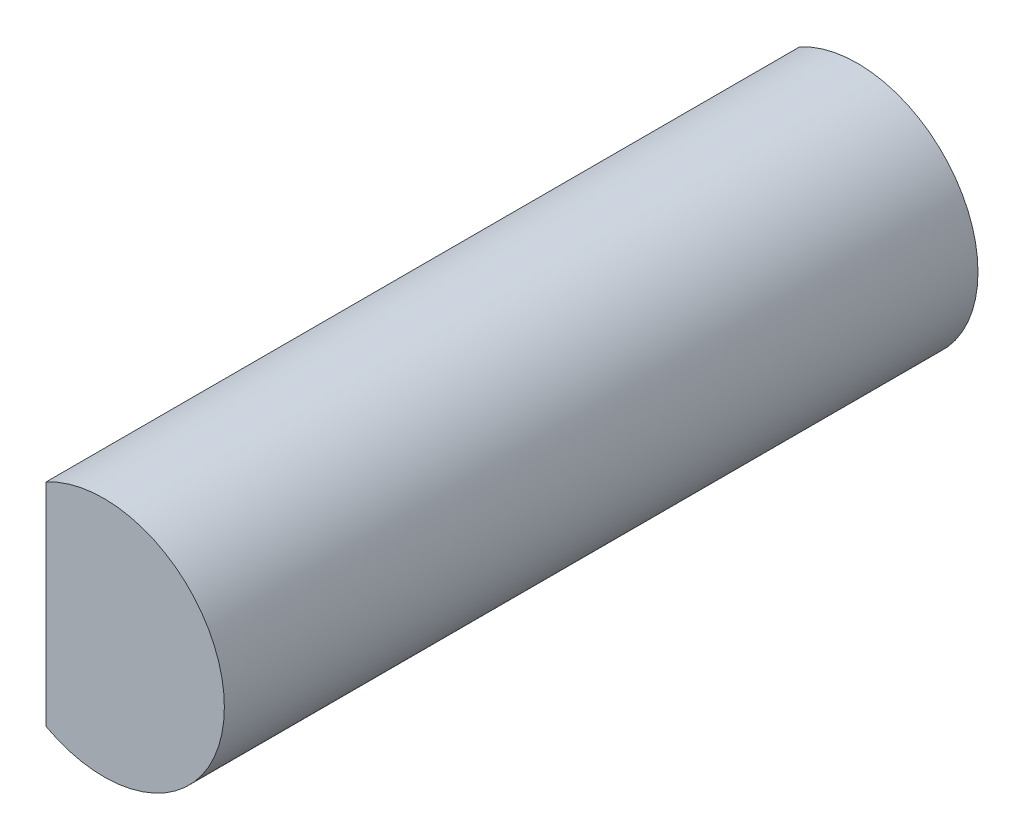
ISO-10303-21;
HEADER;
FILE_DESCRIPTION(('STEP AP214'),'2;1');
FILE_NAME('part.step','',(''),(''),'','','');
FILE_SCHEMA(('AUTOMOTIVE_DESIGN { 1 0 10303 214 1 1 1 1 }'));
ENDSEC;
DATA;
#1=APPLICATION_CONTEXT('core data for automotive mechanical design processes');
#2=APPLICATION_PROTOCOL_DEFINITION('international standard','automotive_design',2000,#1);
#3=PRODUCT_CONTEXT('',#1,'mechanical');
#4=PRODUCT('Part','Part','',(#3));
#5=PRODUCT_RELATED_PRODUCT_CATEGORY('part','',(#4));
#6=PRODUCT_DEFINITION_FORMATION('','',#4);
#7=PRODUCT_DEFINITION_CONTEXT('part definition',#1,'design');
#8=PRODUCT_DEFINITION('design','',#6,#7);
#9=PRODUCT_DEFINITION_SHAPE('','',#8);
#10=(LENGTH_UNIT() NAMED_UNIT(*) SI_UNIT(.MILLI.,.METRE.));
#11=(NAMED_UNIT(*) PLANE_ANGLE_UNIT() SI_UNIT($,.RADIAN.));
#12=(NAMED_UNIT(*) SI_UNIT($,.STERADIAN.) SOLID_ANGLE_UNIT());
#13=UNCERTAINTY_MEASURE_WITH_UNIT(LENGTH_MEASURE(1.E-05),#10,'distance_accuracy_value','');
#14=(GEOMETRIC_REPRESENTATION_CONTEXT(3) GLOBAL_UNCERTAINTY_ASSIGNED_CONTEXT((#13)) GLOBAL_UNIT_ASSIGNED_CONTEXT((#10,
#11,#12)) REPRESENTATION_CONTEXT('',''));
#15=CARTESIAN_POINT('',(0.,0.,0.));
#16=DIRECTION('',(0.,0.,1.));
#17=DIRECTION('',(1.,0.,0.));
#18=AXIS2_PLACEMENT_3D('',#15,#16,#17);
#19=CARTESIAN_POINT('',(0.,0.,30.));
#20=DIRECTION('',(0.,0.,-1.));
#21=DIRECTION('',(-1.,0.,0.));
#22=AXIS2_PLACEMENT_3D('',#19,#20,#21);
#23=CYLINDRICAL_SURFACE('',#22,4.8);
#24=CARTESIAN_POINT('',(0.,0.,0.));
#25=DIRECTION('',(0.,0.,1.));
#26=DIRECTION('',(1.,0.,0.));
#27=AXIS2_PLACEMENT_3D('',#24,#25,#26);
#28=CIRCLE('',#27,4.8);
#29=CARTESIAN_POINT('',(-2.30000000000001,-4.21307488658818,0.));
#30=VERTEX_POINT('',#29);
#31=CARTESIAN_POINT('',(-2.30000000000001,4.21307488658818,0.));
#32=VERTEX_POINT('',#31);
#33=EDGE_CURVE('E70',#30,#32,#28,.T.);
#34=ORIENTED_EDGE('',*,*,#33,.T.);
#35=DIRECTION('',(0.,0.,-1.));
#36=VECTOR('',#35,1.);
#37=CARTESIAN_POINT('',(-2.30000000000001,4.21307488658818,30.));
#38=LINE('',#37,#36);
#39=CARTESIAN_POINT('',(-2.30000000000001,4.21307488658818,30.));
#40=VERTEX_POINT('',#39);
#41=EDGE_CURVE('E11',#40,#32,#38,.T.);
#42=ORIENTED_EDGE('',*,*,#41,.F.);
#43=CARTESIAN_POINT('',(0.,0.,30.));
#44=DIRECTION('',(0.,0.,1.));
#45=DIRECTION('',(1.,0.,0.));
#46=AXIS2_PLACEMENT_3D('',#43,#44,#45);
#47=CIRCLE('',#46,4.8);
#48=CARTESIAN_POINT('',(-2.30000000000001,-4.21307488658818,30.));
#49=VERTEX_POINT('',#48);
#50=EDGE_CURVE('E69',#49,#40,#47,.T.);
#51=ORIENTED_EDGE('',*,*,#50,.F.);
#52=DIRECTION('',(0.,0.,-1.));
#53=VECTOR('',#52,1.);
#54=CARTESIAN_POINT('',(-2.30000000000001,-4.21307488658818,30.));
#55=LINE('',#54,#53);
#56=EDGE_CURVE('E47',#49,#30,#55,.T.);
#57=ORIENTED_EDGE('',*,*,#56,.T.);
#58=EDGE_LOOP('',(#34,#42,#51,#57));
#59=FACE_BOUND('',#58,.T.);
#60=ADVANCED_FACE('F39',(#59),#23,.T.);
#61=CARTESIAN_POINT('',(-2.30000000000001,4.21307488658818,30.));
#62=DIRECTION('',(1.,0.,0.));
#63=DIRECTION('',(0.,0.,-1.));
#64=AXIS2_PLACEMENT_3D('',#61,#62,#63);
#65=PLANE('',#64);
#66=DIRECTION('',(0.,-1.,0.));
#67=VECTOR('',#66,1.);
#68=CARTESIAN_POINT('',(-2.30000000000001,4.21307488658818,0.));
#69=LINE('',#68,#67);
#70=EDGE_CURVE('E62',#32,#30,#69,.T.);
#71=ORIENTED_EDGE('',*,*,#70,.T.);
#72=ORIENTED_EDGE('',*,*,#56,.F.);
#73=DIRECTION('',(0.,-1.,0.));
#74=VECTOR('',#73,1.);
#75=CARTESIAN_POINT('',(-2.30000000000001,4.21307488658818,30.));
#76=LINE('',#75,#74);
#77=EDGE_CURVE('E54',#40,#49,#76,.T.);
#78=ORIENTED_EDGE('',*,*,#77,.F.);
#79=ORIENTED_EDGE('',*,*,#41,.T.);
#80=EDGE_LOOP('',(#71,#72,#78,#79));
#81=FACE_BOUND('',#80,.T.);
#82=ADVANCED_FACE('F65',(#81),#65,.F.);
#83=CARTESIAN_POINT('',(0.,0.,30.));
#84=DIRECTION('',(0.,0.,1.));
#85=DIRECTION('',(1.,0.,0.));
#86=AXIS2_PLACEMENT_3D('',#83,#84,#85);
#87=PLANE('',#86);
#88=ORIENTED_EDGE('',*,*,#50,.T.);
#89=ORIENTED_EDGE('',*,*,#77,.T.);
#90=EDGE_LOOP('',(#88,#89));
#91=FACE_BOUND('',#90,.T.);
#92=ADVANCED_FACE('F77',(#91),#87,.T.);
#93=CARTESIAN_POINT('',(0.,0.,0.));
#94=DIRECTION('',(0.,0.,1.));
#95=DIRECTION('',(1.,0.,0.));
#96=AXIS2_PLACEMENT_3D('',#93,#94,#95);
#97=PLANE('',#96);
#98=ORIENTED_EDGE('',*,*,#33,.F.);
#99=ORIENTED_EDGE('',*,*,#70,.F.);
#100=EDGE_LOOP('',(#98,#99));
#101=FACE_BOUND('',#100,.T.);
#102=ADVANCED_FACE('F73',(#101),#97,.F.);
#103=CLOSED_SHELL('',(#60,#82,#92,#102));
#104=MANIFOLD_SOLID_BREP('B2',#103);
#105=ADVANCED_BREP_SHAPE_REPRESENTATION('',(#18,#104),#14);
#106=SHAPE_DEFINITION_REPRESENTATION(#9,#105);
ENDSEC;
END-ISO-10303-21;
